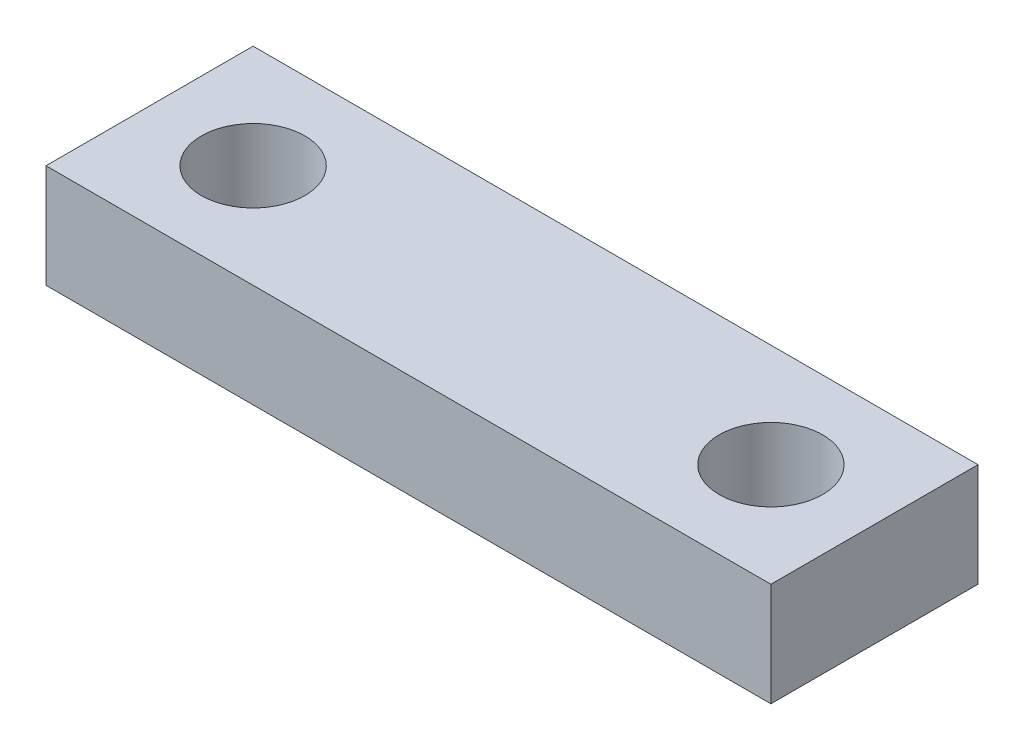
ISO-10303-21;
HEADER;
FILE_DESCRIPTION(('STEP AP214'),'2;1');
FILE_NAME('part.step','',(''),(''),'','','');
FILE_SCHEMA(('AUTOMOTIVE_DESIGN { 1 0 10303 214 1 1 1 1 }'));
ENDSEC;
DATA;
#1=APPLICATION_CONTEXT('core data for automotive mechanical design processes');
#2=APPLICATION_PROTOCOL_DEFINITION('international standard','automotive_design',2000,#1);
#3=PRODUCT_CONTEXT('',#1,'mechanical');
#4=PRODUCT('Part','Part','',(#3));
#5=PRODUCT_RELATED_PRODUCT_CATEGORY('part','',(#4));
#6=PRODUCT_DEFINITION_FORMATION('','',#4);
#7=PRODUCT_DEFINITION_CONTEXT('part definition',#1,'design');
#8=PRODUCT_DEFINITION('design','',#6,#7);
#9=PRODUCT_DEFINITION_SHAPE('','',#8);
#10=(LENGTH_UNIT() NAMED_UNIT(*) SI_UNIT(.MILLI.,.METRE.));
#11=(NAMED_UNIT(*) PLANE_ANGLE_UNIT() SI_UNIT($,.RADIAN.));
#12=(NAMED_UNIT(*) SI_UNIT($,.STERADIAN.) SOLID_ANGLE_UNIT());
#13=UNCERTAINTY_MEASURE_WITH_UNIT(LENGTH_MEASURE(1.E-05),#10,'distance_accuracy_value','');
#14=(GEOMETRIC_REPRESENTATION_CONTEXT(3) GLOBAL_UNCERTAINTY_ASSIGNED_CONTEXT((#13)) GLOBAL_UNIT_ASSIGNED_CONTEXT((#10,
#11,#12)) REPRESENTATION_CONTEXT('',''));
#15=CARTESIAN_POINT('',(0.,0.,0.));
#16=DIRECTION('',(0.,0.,1.));
#17=DIRECTION('',(1.,0.,0.));
#18=AXIS2_PLACEMENT_3D('',#15,#16,#17);
#19=CARTESIAN_POINT('',(0.,2.54,0.));
#20=DIRECTION('',(0.,1.,0.));
#21=DIRECTION('',(0.,0.,1.));
#22=AXIS2_PLACEMENT_3D('',#19,#20,#21);
#23=PLANE('',#22);
#24=CARTESIAN_POINT('',(2.54,2.54,-2.54));
#25=DIRECTION('',(0.,1.,0.));
#26=DIRECTION('',(0.,0.,1.));
#27=AXIS2_PLACEMENT_3D('',#24,#25,#26);
#28=CIRCLE('',#27,1.27);
#29=CARTESIAN_POINT('',(2.54,2.54,-1.27));
#30=VERTEX_POINT('',#29);
#31=EDGE_CURVE('E100',#30,#30,#28,.T.);
#32=ORIENTED_EDGE('',*,*,#31,.F.);
#33=EDGE_LOOP('',(#32));
#34=FACE_BOUND('',#33,.T.);
#35=DIRECTION('',(0.,0.,1.));
#36=VECTOR('',#35,1.);
#37=CARTESIAN_POINT('',(0.,2.54,-5.08));
#38=LINE('',#37,#36);
#39=CARTESIAN_POINT('',(0.,2.54,-5.08));
#40=VERTEX_POINT('',#39);
#41=CARTESIAN_POINT('',(0.,2.54,0.));
#42=VERTEX_POINT('',#41);
#43=EDGE_CURVE('E85',#40,#42,#38,.T.);
#44=ORIENTED_EDGE('',*,*,#43,.T.);
#45=DIRECTION('',(1.,0.,0.));
#46=VECTOR('',#45,1.);
#47=CARTESIAN_POINT('',(0.,2.54,0.));
#48=LINE('',#47,#46);
#49=CARTESIAN_POINT('',(17.78,2.54,0.));
#50=VERTEX_POINT('',#49);
#51=EDGE_CURVE('E80',#42,#50,#48,.T.);
#52=ORIENTED_EDGE('',*,*,#51,.T.);
#53=DIRECTION('',(0.,0.,-1.));
#54=VECTOR('',#53,1.);
#55=CARTESIAN_POINT('',(17.78,2.54,0.));
#56=LINE('',#55,#54);
#57=CARTESIAN_POINT('',(17.78,2.54,-5.08));
#58=VERTEX_POINT('',#57);
#59=EDGE_CURVE('E83',#50,#58,#56,.T.);
#60=ORIENTED_EDGE('',*,*,#59,.T.);
#61=DIRECTION('',(-1.,0.,0.));
#62=VECTOR('',#61,1.);
#63=CARTESIAN_POINT('',(17.78,2.54,-5.08));
#64=LINE('',#63,#62);
#65=EDGE_CURVE('E50',#58,#40,#64,.T.);
#66=ORIENTED_EDGE('',*,*,#65,.T.);
#67=EDGE_LOOP('',(#44,#52,#60,#66));
#68=FACE_BOUND('',#67,.T.);
#69=CARTESIAN_POINT('',(15.24,2.54,-2.54));
#70=DIRECTION('',(0.,1.,0.));
#71=DIRECTION('',(0.,0.,1.));
#72=AXIS2_PLACEMENT_3D('',#69,#70,#71);
#73=CIRCLE('',#72,1.27);
#74=CARTESIAN_POINT('',(15.24,2.54,-1.27));
#75=VERTEX_POINT('',#74);
#76=EDGE_CURVE('E115',#75,#75,#73,.T.);
#77=ORIENTED_EDGE('',*,*,#76,.F.);
#78=EDGE_LOOP('',(#77));
#79=FACE_BOUND('',#78,.T.);
#80=ADVANCED_FACE('F33',(#34,#68,#79),#23,.T.);
#81=CARTESIAN_POINT('',(0.,0.,0.));
#82=DIRECTION('',(0.,1.,0.));
#83=DIRECTION('',(0.,0.,1.));
#84=AXIS2_PLACEMENT_3D('',#81,#82,#83);
#85=PLANE('',#84);
#86=DIRECTION('',(0.,0.,1.));
#87=VECTOR('',#86,1.);
#88=CARTESIAN_POINT('',(0.,0.,-5.08));
#89=LINE('',#88,#87);
#90=CARTESIAN_POINT('',(0.,0.,-5.08));
#91=VERTEX_POINT('',#90);
#92=CARTESIAN_POINT('',(0.,0.,0.));
#93=VERTEX_POINT('',#92);
#94=EDGE_CURVE('E97',#91,#93,#89,.T.);
#95=ORIENTED_EDGE('',*,*,#94,.F.);
#96=DIRECTION('',(-1.,0.,0.));
#97=VECTOR('',#96,1.);
#98=CARTESIAN_POINT('',(17.78,0.,-5.08));
#99=LINE('',#98,#97);
#100=CARTESIAN_POINT('',(17.78,0.,-5.08));
#101=VERTEX_POINT('',#100);
#102=EDGE_CURVE('E73',#101,#91,#99,.T.);
#103=ORIENTED_EDGE('',*,*,#102,.F.);
#104=DIRECTION('',(0.,0.,-1.));
#105=VECTOR('',#104,1.);
#106=CARTESIAN_POINT('',(17.78,0.,0.));
#107=LINE('',#106,#105);
#108=CARTESIAN_POINT('',(17.78,0.,0.));
#109=VERTEX_POINT('',#108);
#110=EDGE_CURVE('E67',#109,#101,#107,.T.);
#111=ORIENTED_EDGE('',*,*,#110,.F.);
#112=DIRECTION('',(1.,0.,0.));
#113=VECTOR('',#112,1.);
#114=CARTESIAN_POINT('',(0.,0.,0.));
#115=LINE('',#114,#113);
#116=EDGE_CURVE('E89',#93,#109,#115,.T.);
#117=ORIENTED_EDGE('',*,*,#116,.F.);
#118=EDGE_LOOP('',(#95,#103,#111,#117));
#119=FACE_BOUND('',#118,.T.);
#120=CARTESIAN_POINT('',(2.54,0.,-2.54));
#121=DIRECTION('',(0.,1.,0.));
#122=DIRECTION('',(0.,0.,1.));
#123=AXIS2_PLACEMENT_3D('',#120,#121,#122);
#124=CIRCLE('',#123,1.27);
#125=CARTESIAN_POINT('',(2.54,0.,-1.27));
#126=VERTEX_POINT('',#125);
#127=EDGE_CURVE('E112',#126,#126,#124,.T.);
#128=ORIENTED_EDGE('',*,*,#127,.T.);
#129=EDGE_LOOP('',(#128));
#130=FACE_BOUND('',#129,.T.);
#131=CARTESIAN_POINT('',(15.24,0.,-2.54));
#132=DIRECTION('',(0.,1.,0.));
#133=DIRECTION('',(0.,0.,1.));
#134=AXIS2_PLACEMENT_3D('',#131,#132,#133);
#135=CIRCLE('',#134,1.27);
#136=CARTESIAN_POINT('',(15.24,0.,-1.27));
#137=VERTEX_POINT('',#136);
#138=EDGE_CURVE('E118',#137,#137,#135,.T.);
#139=ORIENTED_EDGE('',*,*,#138,.T.);
#140=EDGE_LOOP('',(#139));
#141=FACE_BOUND('',#140,.T.);
#142=ADVANCED_FACE('F108',(#119,#130,#141),#85,.F.);
#143=CARTESIAN_POINT('',(0.,2.54,-5.08));
#144=DIRECTION('',(1.,0.,0.));
#145=DIRECTION('',(0.,0.,-1.));
#146=AXIS2_PLACEMENT_3D('',#143,#144,#145);
#147=PLANE('',#146);
#148=ORIENTED_EDGE('',*,*,#94,.T.);
#149=DIRECTION('',(0.,-1.,0.));
#150=VECTOR('',#149,1.);
#151=CARTESIAN_POINT('',(0.,2.54,0.));
#152=LINE('',#151,#150);
#153=EDGE_CURVE('E11',#42,#93,#152,.T.);
#154=ORIENTED_EDGE('',*,*,#153,.F.);
#155=ORIENTED_EDGE('',*,*,#43,.F.);
#156=DIRECTION('',(0.,-1.,0.));
#157=VECTOR('',#156,1.);
#158=CARTESIAN_POINT('',(0.,2.54,-5.08));
#159=LINE('',#158,#157);
#160=EDGE_CURVE('E93',#40,#91,#159,.T.);
#161=ORIENTED_EDGE('',*,*,#160,.T.);
#162=EDGE_LOOP('',(#148,#154,#155,#161));
#163=FACE_BOUND('',#162,.T.);
#164=ADVANCED_FACE('F35',(#163),#147,.F.);
#165=CARTESIAN_POINT('',(0.,2.54,0.));
#166=DIRECTION('',(0.,0.,-1.));
#167=DIRECTION('',(-1.,0.,0.));
#168=AXIS2_PLACEMENT_3D('',#165,#166,#167);
#169=PLANE('',#168);
#170=ORIENTED_EDGE('',*,*,#116,.T.);
#171=DIRECTION('',(0.,-1.,0.));
#172=VECTOR('',#171,1.);
#173=CARTESIAN_POINT('',(17.78,2.54,0.));
#174=LINE('',#173,#172);
#175=EDGE_CURVE('E42',#50,#109,#174,.T.);
#176=ORIENTED_EDGE('',*,*,#175,.F.);
#177=ORIENTED_EDGE('',*,*,#51,.F.);
#178=ORIENTED_EDGE('',*,*,#153,.T.);
#179=EDGE_LOOP('',(#170,#176,#177,#178));
#180=FACE_BOUND('',#179,.T.);
#181=ADVANCED_FACE('F88',(#180),#169,.F.);
#182=CARTESIAN_POINT('',(17.78,2.54,0.));
#183=DIRECTION('',(-1.,0.,0.));
#184=DIRECTION('',(0.,0.,1.));
#185=AXIS2_PLACEMENT_3D('',#182,#183,#184);
#186=PLANE('',#185);
#187=ORIENTED_EDGE('',*,*,#110,.T.);
#188=DIRECTION('',(0.,-1.,0.));
#189=VECTOR('',#188,1.);
#190=CARTESIAN_POINT('',(17.78,2.54,-5.08));
#191=LINE('',#190,#189);
#192=EDGE_CURVE('E90',#58,#101,#191,.T.);
#193=ORIENTED_EDGE('',*,*,#192,.F.);
#194=ORIENTED_EDGE('',*,*,#59,.F.);
#195=ORIENTED_EDGE('',*,*,#175,.T.);
#196=EDGE_LOOP('',(#187,#193,#194,#195));
#197=FACE_BOUND('',#196,.T.);
#198=ADVANCED_FACE('F91',(#197),#186,.F.);
#199=CARTESIAN_POINT('',(17.78,2.54,-5.08));
#200=DIRECTION('',(0.,0.,1.));
#201=DIRECTION('',(1.,0.,0.));
#202=AXIS2_PLACEMENT_3D('',#199,#200,#201);
#203=PLANE('',#202);
#204=ORIENTED_EDGE('',*,*,#102,.T.);
#205=ORIENTED_EDGE('',*,*,#160,.F.);
#206=ORIENTED_EDGE('',*,*,#65,.F.);
#207=ORIENTED_EDGE('',*,*,#192,.T.);
#208=EDGE_LOOP('',(#204,#205,#206,#207));
#209=FACE_BOUND('',#208,.T.);
#210=ADVANCED_FACE('F105',(#209),#203,.F.);
#211=CARTESIAN_POINT('',(2.54,2.54,-2.54));
#212=DIRECTION('',(0.,-1.,0.));
#213=DIRECTION('',(0.,0.,-1.));
#214=AXIS2_PLACEMENT_3D('',#211,#212,#213);
#215=CYLINDRICAL_SURFACE('',#214,1.27);
#216=ORIENTED_EDGE('',*,*,#31,.T.);
#217=EDGE_LOOP('',(#216));
#218=FACE_BOUND('',#217,.T.);
#219=ORIENTED_EDGE('',*,*,#127,.F.);
#220=EDGE_LOOP('',(#219));
#221=FACE_BOUND('',#220,.T.);
#222=ADVANCED_FACE('F135',(#218,#221),#215,.F.);
#223=CARTESIAN_POINT('',(15.24,2.54,-2.54));
#224=DIRECTION('',(0.,-1.,0.));
#225=DIRECTION('',(0.,0.,-1.));
#226=AXIS2_PLACEMENT_3D('',#223,#224,#225);
#227=CYLINDRICAL_SURFACE('',#226,1.27);
#228=ORIENTED_EDGE('',*,*,#76,.T.);
#229=EDGE_LOOP('',(#228));
#230=FACE_BOUND('',#229,.T.);
#231=ORIENTED_EDGE('',*,*,#138,.F.);
#232=EDGE_LOOP('',(#231));
#233=FACE_BOUND('',#232,.T.);
#234=ADVANCED_FACE('F124',(#230,#233),#227,.F.);
#235=CLOSED_SHELL('',(#80,#142,#164,#181,#198,#210,#222,#234));
#236=MANIFOLD_SOLID_BREP('B2',#235);
#237=ADVANCED_BREP_SHAPE_REPRESENTATION('',(#18,#236),#14);
#238=SHAPE_DEFINITION_REPRESENTATION(#9,#237);
ENDSEC;
END-ISO-10303-21;
